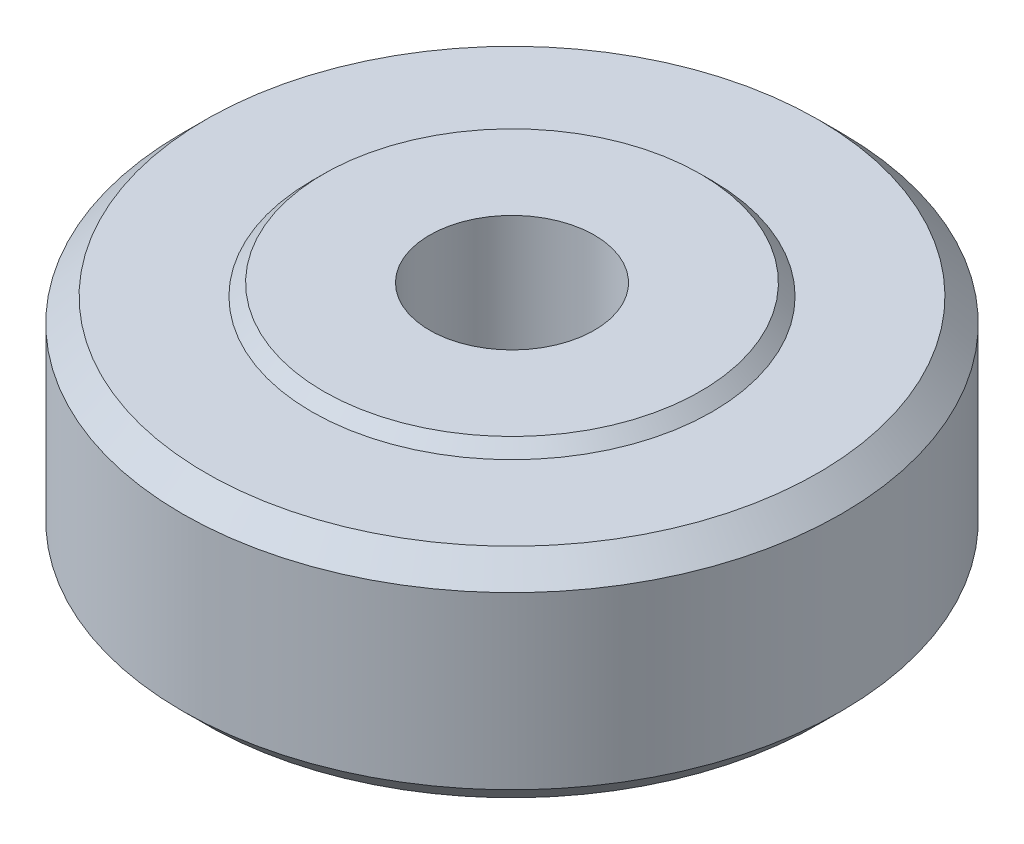
ISO-10303-21;
HEADER;
FILE_DESCRIPTION(('STEP AP214'),'2;1');
FILE_NAME('part.step','',(''),(''),'','','');
FILE_SCHEMA(('AUTOMOTIVE_DESIGN { 1 0 10303 214 1 1 1 1 }'));
ENDSEC;
DATA;
#1=APPLICATION_CONTEXT('core data for automotive mechanical design processes');
#2=APPLICATION_PROTOCOL_DEFINITION('international standard','automotive_design',2000,#1);
#3=PRODUCT_CONTEXT('',#1,'mechanical');
#4=PRODUCT('Part','Part','',(#3));
#5=PRODUCT_RELATED_PRODUCT_CATEGORY('part','',(#4));
#6=PRODUCT_DEFINITION_FORMATION('','',#4);
#7=PRODUCT_DEFINITION_CONTEXT('part definition',#1,'design');
#8=PRODUCT_DEFINITION('design','',#6,#7);
#9=PRODUCT_DEFINITION_SHAPE('','',#8);
#10=(LENGTH_UNIT() NAMED_UNIT(*) SI_UNIT(.MILLI.,.METRE.));
#11=(NAMED_UNIT(*) PLANE_ANGLE_UNIT() SI_UNIT($,.RADIAN.));
#12=(NAMED_UNIT(*) SI_UNIT($,.STERADIAN.) SOLID_ANGLE_UNIT());
#13=UNCERTAINTY_MEASURE_WITH_UNIT(LENGTH_MEASURE(1.E-05),#10,'distance_accuracy_value','');
#14=(GEOMETRIC_REPRESENTATION_CONTEXT(3) GLOBAL_UNCERTAINTY_ASSIGNED_CONTEXT((#13)) GLOBAL_UNIT_ASSIGNED_CONTEXT((#10,
#11,#12)) REPRESENTATION_CONTEXT('',''));
#15=CARTESIAN_POINT('',(0.,0.,0.));
#16=DIRECTION('',(0.,0.,1.));
#17=DIRECTION('',(1.,0.,0.));
#18=AXIS2_PLACEMENT_3D('',#15,#16,#17);
#19=CARTESIAN_POINT('',(16.,10.25,0.));
#20=DIRECTION('',(0.,1.,0.));
#21=DIRECTION('',(0.,0.,1.));
#22=AXIS2_PLACEMENT_3D('',#19,#20,#21);
#23=PLANE('',#22);
#24=CARTESIAN_POINT('',(0.,10.25,0.));
#25=DIRECTION('',(0.,-1.,0.));
#26=DIRECTION('',(0.,0.,-1.));
#27=AXIS2_PLACEMENT_3D('',#24,#25,#26);
#28=CIRCLE('',#27,7.);
#29=CARTESIAN_POINT('',(0.,10.25,-7.));
#30=VERTEX_POINT('',#29);
#31=EDGE_CURVE('E10',#30,#30,#28,.T.);
#32=ORIENTED_EDGE('',*,*,#31,.T.);
#33=EDGE_LOOP('',(#32));
#34=FACE_BOUND('',#33,.T.);
#35=CARTESIAN_POINT('',(0.,10.25,0.));
#36=DIRECTION('',(0.,-1.,0.));
#37=DIRECTION('',(0.,0.,-1.));
#38=AXIS2_PLACEMENT_3D('',#35,#36,#37);
#39=CIRCLE('',#38,16.);
#40=CARTESIAN_POINT('',(0.,10.25,-16.));
#41=VERTEX_POINT('',#40);
#42=EDGE_CURVE('E65',#41,#41,#39,.T.);
#43=ORIENTED_EDGE('',*,*,#42,.F.);
#44=EDGE_LOOP('',(#43));
#45=FACE_BOUND('',#44,.T.);
#46=ADVANCED_FACE('F31',(#34,#45),#23,.T.);
#47=CARTESIAN_POINT('',(0.,0.,0.));
#48=DIRECTION('',(0.,-1.,0.));
#49=DIRECTION('',(0.,0.,-1.));
#50=AXIS2_PLACEMENT_3D('',#47,#48,#49);
#51=CYLINDRICAL_SURFACE('',#50,7.);
#52=CARTESIAN_POINT('',(0.,-10.25,0.));
#53=DIRECTION('',(0.,-1.,0.));
#54=DIRECTION('',(0.,0.,-1.));
#55=AXIS2_PLACEMENT_3D('',#52,#53,#54);
#56=CIRCLE('',#55,7.);
#57=CARTESIAN_POINT('',(0.,-10.25,-7.));
#58=VERTEX_POINT('',#57);
#59=EDGE_CURVE('E37',#58,#58,#56,.T.);
#60=ORIENTED_EDGE('',*,*,#59,.T.);
#61=EDGE_LOOP('',(#60));
#62=FACE_BOUND('',#61,.T.);
#63=ORIENTED_EDGE('',*,*,#31,.F.);
#64=EDGE_LOOP('',(#63));
#65=FACE_BOUND('',#64,.T.);
#66=ADVANCED_FACE('F73',(#62,#65),#51,.F.);
#67=CARTESIAN_POINT('',(7.,-10.25,0.));
#68=DIRECTION('',(0.,-1.,0.));
#69=DIRECTION('',(0.,0.,-1.));
#70=AXIS2_PLACEMENT_3D('',#67,#68,#69);
#71=PLANE('',#70);
#72=CARTESIAN_POINT('',(0.,-10.25,0.));
#73=DIRECTION('',(0.,-1.,0.));
#74=DIRECTION('',(0.,0.,-1.));
#75=AXIS2_PLACEMENT_3D('',#72,#73,#74);
#76=CIRCLE('',#75,16.);
#77=CARTESIAN_POINT('',(0.,-10.25,-16.));
#78=VERTEX_POINT('',#77);
#79=EDGE_CURVE('E41',#78,#78,#76,.T.);
#80=ORIENTED_EDGE('',*,*,#79,.T.);
#81=EDGE_LOOP('',(#80));
#82=FACE_BOUND('',#81,.T.);
#83=ORIENTED_EDGE('',*,*,#59,.F.);
#84=EDGE_LOOP('',(#83));
#85=FACE_BOUND('',#84,.T.);
#86=ADVANCED_FACE('F77',(#82,#85),#71,.T.);
#87=CARTESIAN_POINT('',(0.,-10.25,0.));
#88=DIRECTION('',(0.,1.,0.));
#89=DIRECTION('',(0.,0.,1.));
#90=AXIS2_PLACEMENT_3D('',#87,#88,#89);
#91=CONICAL_SURFACE('',#90,16.,0.785398163397455);
#92=CARTESIAN_POINT('',(0.,-9.25,0.));
#93=DIRECTION('',(0.,-1.,0.));
#94=DIRECTION('',(0.,0.,-1.));
#95=AXIS2_PLACEMENT_3D('',#92,#93,#94);
#96=CIRCLE('',#95,17.);
#97=CARTESIAN_POINT('',(0.,-9.25,-17.));
#98=VERTEX_POINT('',#97);
#99=EDGE_CURVE('E45',#98,#98,#96,.T.);
#100=ORIENTED_EDGE('',*,*,#99,.T.);
#101=EDGE_LOOP('',(#100));
#102=FACE_BOUND('',#101,.T.);
#103=ORIENTED_EDGE('',*,*,#79,.F.);
#104=EDGE_LOOP('',(#103));
#105=FACE_BOUND('',#104,.T.);
#106=ADVANCED_FACE('F81',(#102,#105),#91,.T.);
#107=CARTESIAN_POINT('',(17.,-9.25,0.));
#108=DIRECTION('',(0.,-1.,0.));
#109=DIRECTION('',(0.,0.,-1.));
#110=AXIS2_PLACEMENT_3D('',#107,#108,#109);
#111=PLANE('',#110);
#112=CARTESIAN_POINT('',(0.,-9.25,0.));
#113=DIRECTION('',(0.,-1.,0.));
#114=DIRECTION('',(0.,0.,-1.));
#115=AXIS2_PLACEMENT_3D('',#112,#113,#114);
#116=CIRCLE('',#115,26.);
#117=CARTESIAN_POINT('',(0.,-9.25,-26.));
#118=VERTEX_POINT('',#117);
#119=EDGE_CURVE('E50',#118,#118,#116,.T.);
#120=ORIENTED_EDGE('',*,*,#119,.T.);
#121=EDGE_LOOP('',(#120));
#122=FACE_BOUND('',#121,.T.);
#123=ORIENTED_EDGE('',*,*,#99,.F.);
#124=EDGE_LOOP('',(#123));
#125=FACE_BOUND('',#124,.T.);
#126=ADVANCED_FACE('F88',(#122,#125),#111,.T.);
#127=CARTESIAN_POINT('',(0.,-9.25,0.));
#128=DIRECTION('',(0.,1.,0.));
#129=DIRECTION('',(0.,0.,1.));
#130=AXIS2_PLACEMENT_3D('',#127,#128,#129);
#131=CONICAL_SURFACE('',#130,26.,0.785398163397449);
#132=CARTESIAN_POINT('',(0.,-7.25,0.));
#133=DIRECTION('',(0.,-1.,0.));
#134=DIRECTION('',(0.,0.,-1.));
#135=AXIS2_PLACEMENT_3D('',#132,#133,#134);
#136=CIRCLE('',#135,28.);
#137=CARTESIAN_POINT('',(0.,-7.25,-28.));
#138=VERTEX_POINT('',#137);
#139=EDGE_CURVE('E53',#138,#138,#136,.T.);
#140=ORIENTED_EDGE('',*,*,#139,.T.);
#141=EDGE_LOOP('',(#140));
#142=FACE_BOUND('',#141,.T.);
#143=ORIENTED_EDGE('',*,*,#119,.F.);
#144=EDGE_LOOP('',(#143));
#145=FACE_BOUND('',#144,.T.);
#146=ADVANCED_FACE('F92',(#142,#145),#131,.T.);
#147=CARTESIAN_POINT('',(0.,0.,0.));
#148=DIRECTION('',(0.,-1.,0.));
#149=DIRECTION('',(0.,0.,-1.));
#150=AXIS2_PLACEMENT_3D('',#147,#148,#149);
#151=CYLINDRICAL_SURFACE('',#150,28.);
#152=CARTESIAN_POINT('',(0.,7.25,0.));
#153=DIRECTION('',(0.,-1.,0.));
#154=DIRECTION('',(0.,0.,-1.));
#155=AXIS2_PLACEMENT_3D('',#152,#153,#154);
#156=CIRCLE('',#155,28.);
#157=CARTESIAN_POINT('',(0.,7.25,-28.));
#158=VERTEX_POINT('',#157);
#159=EDGE_CURVE('E56',#158,#158,#156,.T.);
#160=ORIENTED_EDGE('',*,*,#159,.T.);
#161=EDGE_LOOP('',(#160));
#162=FACE_BOUND('',#161,.T.);
#163=ORIENTED_EDGE('',*,*,#139,.F.);
#164=EDGE_LOOP('',(#163));
#165=FACE_BOUND('',#164,.T.);
#166=ADVANCED_FACE('F96',(#162,#165),#151,.T.);
#167=CARTESIAN_POINT('',(0.,7.25,0.));
#168=DIRECTION('',(0.,-1.,0.));
#169=DIRECTION('',(0.,0.,-1.));
#170=AXIS2_PLACEMENT_3D('',#167,#168,#169);
#171=CONICAL_SURFACE('',#170,28.,0.785398163397449);
#172=CARTESIAN_POINT('',(0.,9.25,0.));
#173=DIRECTION('',(0.,-1.,0.));
#174=DIRECTION('',(0.,0.,-1.));
#175=AXIS2_PLACEMENT_3D('',#172,#173,#174);
#176=CIRCLE('',#175,26.);
#177=CARTESIAN_POINT('',(0.,9.25,-26.));
#178=VERTEX_POINT('',#177);
#179=EDGE_CURVE('E59',#178,#178,#176,.T.);
#180=ORIENTED_EDGE('',*,*,#179,.T.);
#181=EDGE_LOOP('',(#180));
#182=FACE_BOUND('',#181,.T.);
#183=ORIENTED_EDGE('',*,*,#159,.F.);
#184=EDGE_LOOP('',(#183));
#185=FACE_BOUND('',#184,.T.);
#186=ADVANCED_FACE('F100',(#182,#185),#171,.T.);
#187=CARTESIAN_POINT('',(26.,9.25,0.));
#188=DIRECTION('',(0.,1.,0.));
#189=DIRECTION('',(0.,0.,1.));
#190=AXIS2_PLACEMENT_3D('',#187,#188,#189);
#191=PLANE('',#190);
#192=CARTESIAN_POINT('',(0.,9.25,0.));
#193=DIRECTION('',(0.,-1.,0.));
#194=DIRECTION('',(0.,0.,-1.));
#195=AXIS2_PLACEMENT_3D('',#192,#193,#194);
#196=CIRCLE('',#195,17.);
#197=CARTESIAN_POINT('',(0.,9.25,-17.));
#198=VERTEX_POINT('',#197);
#199=EDGE_CURVE('E62',#198,#198,#196,.T.);
#200=ORIENTED_EDGE('',*,*,#199,.T.);
#201=EDGE_LOOP('',(#200));
#202=FACE_BOUND('',#201,.T.);
#203=ORIENTED_EDGE('',*,*,#179,.F.);
#204=EDGE_LOOP('',(#203));
#205=FACE_BOUND('',#204,.T.);
#206=ADVANCED_FACE('F104',(#202,#205),#191,.T.);
#207=CARTESIAN_POINT('',(0.,9.25,0.));
#208=DIRECTION('',(0.,-1.,0.));
#209=DIRECTION('',(0.,0.,-1.));
#210=AXIS2_PLACEMENT_3D('',#207,#208,#209);
#211=CONICAL_SURFACE('',#210,17.,0.785398163397448);
#212=ORIENTED_EDGE('',*,*,#42,.T.);
#213=EDGE_LOOP('',(#212));
#214=FACE_BOUND('',#213,.T.);
#215=ORIENTED_EDGE('',*,*,#199,.F.);
#216=EDGE_LOOP('',(#215));
#217=FACE_BOUND('',#216,.T.);
#218=ADVANCED_FACE('F69',(#214,#217),#211,.T.);
#219=CLOSED_SHELL('',(#46,#66,#86,#106,#126,#146,#166,#186,#206,#218));
#220=MANIFOLD_SOLID_BREP('B2',#219);
#221=ADVANCED_BREP_SHAPE_REPRESENTATION('',(#18,#220),#14);
#222=SHAPE_DEFINITION_REPRESENTATION(#9,#221);
ENDSEC;
END-ISO-10303-21;
